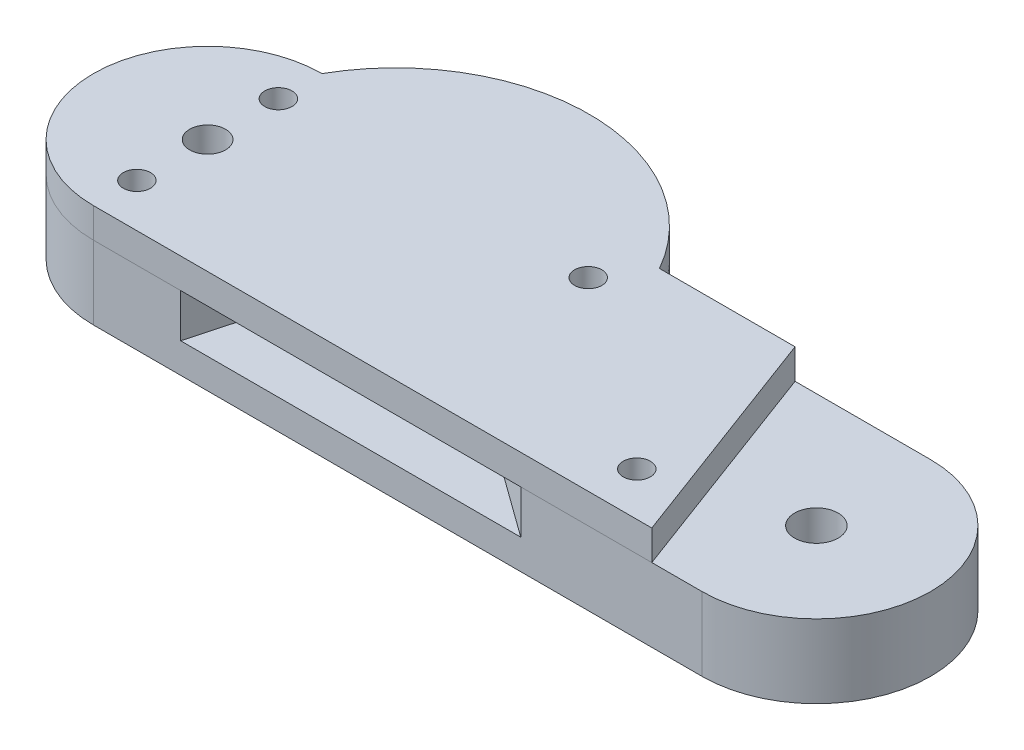
ISO-10303-21;
HEADER;
FILE_DESCRIPTION(('STEP AP214'),'2;1');
FILE_NAME('part.step','',(''),(''),'','','');
FILE_SCHEMA(('AUTOMOTIVE_DESIGN { 1 0 10303 214 1 1 1 1 }'));
ENDSEC;
DATA;
#1=APPLICATION_CONTEXT('core data for automotive mechanical design processes');
#2=APPLICATION_PROTOCOL_DEFINITION('international standard','automotive_design',2000,#1);
#3=PRODUCT_CONTEXT('',#1,'mechanical');
#4=PRODUCT('Part','Part','',(#3));
#5=PRODUCT_RELATED_PRODUCT_CATEGORY('part','',(#4));
#6=PRODUCT_DEFINITION_FORMATION('','',#4);
#7=PRODUCT_DEFINITION_CONTEXT('part definition',#1,'design');
#8=PRODUCT_DEFINITION('design','',#6,#7);
#9=PRODUCT_DEFINITION_SHAPE('','',#8);
#10=(LENGTH_UNIT() NAMED_UNIT(*) SI_UNIT(.MILLI.,.METRE.));
#11=(NAMED_UNIT(*) PLANE_ANGLE_UNIT() SI_UNIT($,.RADIAN.));
#12=(NAMED_UNIT(*) SI_UNIT($,.STERADIAN.) SOLID_ANGLE_UNIT());
#13=UNCERTAINTY_MEASURE_WITH_UNIT(LENGTH_MEASURE(1.E-05),#10,'distance_accuracy_value','');
#14=(GEOMETRIC_REPRESENTATION_CONTEXT(3) GLOBAL_UNCERTAINTY_ASSIGNED_CONTEXT((#13)) GLOBAL_UNIT_ASSIGNED_CONTEXT((#10,
#11,#12)) REPRESENTATION_CONTEXT('',''));
#15=CARTESIAN_POINT('',(0.,0.,0.));
#16=DIRECTION('',(0.,0.,1.));
#17=DIRECTION('',(1.,0.,0.));
#18=AXIS2_PLACEMENT_3D('',#15,#16,#17);
#19=CARTESIAN_POINT('',(0.,2.,0.));
#20=DIRECTION('',(0.,-1.,0.));
#21=DIRECTION('',(0.,0.,-1.));
#22=AXIS2_PLACEMENT_3D('',#19,#20,#21);
#23=PLANE('',#22);
#24=CARTESIAN_POINT('',(-40.4241193156667,2.,-1.7460511013579));
#25=DIRECTION('',(0.,1.,0.));
#26=DIRECTION('',(0.,0.,1.));
#27=AXIS2_PLACEMENT_3D('',#24,#25,#26);
#28=CIRCLE('',#27,17.8069548217708);
#29=CARTESIAN_POINT('',(-24.917700351162,2.,-10.5003992165423));
#30=VERTEX_POINT('',#29);
#31=CARTESIAN_POINT('',(-55.9305382801715,2.,-10.5003992165423));
#32=VERTEX_POINT('',#31);
#33=EDGE_CURVE('E150',#30,#32,#28,.T.);
#34=ORIENTED_EDGE('',*,*,#33,.F.);
#35=DIRECTION('',(1.,0.,0.));
#36=VECTOR('',#35,1.);
#37=CARTESIAN_POINT('',(0.,2.,-10.5003992165423));
#38=LINE('',#37,#36);
#39=CARTESIAN_POINT('',(-12.458850175581,2.,-10.5003992165423));
#40=VERTEX_POINT('',#39);
#41=EDGE_CURVE('E115',#30,#40,#38,.T.);
#42=ORIENTED_EDGE('',*,*,#41,.T.);
#43=DIRECTION('',(-0.349715205744596,0.,-0.93685605877905));
#44=VECTOR('',#43,1.);
#45=CARTESIAN_POINT('',(-12.458850175581,2.,-10.5003992165423));
#46=LINE('',#45,#44);
#47=CARTESIAN_POINT('',(-4.6195471407067,2.,10.5003992165423));
#48=VERTEX_POINT('',#47);
#49=EDGE_CURVE('E100',#48,#40,#46,.T.);
#50=ORIENTED_EDGE('',*,*,#49,.F.);
#51=DIRECTION('',(1.,0.,0.));
#52=VECTOR('',#51,1.);
#53=CARTESIAN_POINT('',(0.,2.,10.5003992165423));
#54=LINE('',#53,#52);
#55=CARTESIAN_POINT('',(-55.9305382801715,2.,10.5003992165423));
#56=VERTEX_POINT('',#55);
#57=EDGE_CURVE('E94',#56,#48,#54,.T.);
#58=ORIENTED_EDGE('',*,*,#57,.F.);
#59=CARTESIAN_POINT('',(-55.9305382801715,2.,0.));
#60=DIRECTION('',(0.,-1.,0.));
#61=DIRECTION('',(0.,0.,-1.));
#62=AXIS2_PLACEMENT_3D('',#59,#60,#61);
#63=CIRCLE('',#62,10.5003992165423);
#64=EDGE_CURVE('E98',#56,#32,#63,.T.);
#65=ORIENTED_EDGE('',*,*,#64,.T.);
#66=EDGE_LOOP('',(#34,#42,#50,#58,#65));
#67=FACE_BOUND('',#66,.T.);
#68=CARTESIAN_POINT('',(-55.9305382801715,2.,6.5003992165423));
#69=DIRECTION('',(0.,-1.,0.));
#70=DIRECTION('',(0.,0.,-1.));
#71=AXIS2_PLACEMENT_3D('',#68,#69,#70);
#72=CIRCLE('',#71,1.25);
#73=CARTESIAN_POINT('',(-55.9305382801715,2.,5.25039921654231));
#74=VERTEX_POINT('',#73);
#75=EDGE_CURVE('E123',#74,#74,#72,.F.);
#76=ORIENTED_EDGE('',*,*,#75,.T.);
#77=EDGE_LOOP('',(#76));
#78=FACE_BOUND('',#77,.T.);
#79=CARTESIAN_POINT('',(-55.9305382801715,2.,0.));
#80=DIRECTION('',(0.,-1.,0.));
#81=DIRECTION('',(0.,0.,-1.));
#82=AXIS2_PLACEMENT_3D('',#79,#80,#81);
#83=CIRCLE('',#82,1.65);
#84=CARTESIAN_POINT('',(-55.9305382801715,2.,-1.65));
#85=VERTEX_POINT('',#84);
#86=EDGE_CURVE('E103',#85,#85,#83,.T.);
#87=ORIENTED_EDGE('',*,*,#86,.F.);
#88=EDGE_LOOP('',(#87));
#89=FACE_BOUND('',#88,.T.);
#90=CARTESIAN_POINT('',(-55.9305382801715,2.,-6.5003992165423));
#91=DIRECTION('',(0.,-1.,0.));
#92=DIRECTION('',(0.,0.,-1.));
#93=AXIS2_PLACEMENT_3D('',#90,#91,#92);
#94=CIRCLE('',#93,1.25);
#95=CARTESIAN_POINT('',(-55.9305382801715,2.,-7.7503992165423));
#96=VERTEX_POINT('',#95);
#97=EDGE_CURVE('E117',#96,#96,#94,.F.);
#98=ORIENTED_EDGE('',*,*,#97,.T.);
#99=EDGE_LOOP('',(#98));
#100=FACE_BOUND('',#99,.T.);
#101=CARTESIAN_POINT('',(-27.4615510728353,2.,-6.5003992165423));
#102=DIRECTION('',(0.,-1.,0.));
#103=DIRECTION('',(0.,0.,-1.));
#104=AXIS2_PLACEMENT_3D('',#101,#102,#103);
#105=CIRCLE('',#104,1.25);
#106=CARTESIAN_POINT('',(-27.4615510728353,2.,-7.7503992165423));
#107=VERTEX_POINT('',#106);
#108=EDGE_CURVE('E129',#107,#107,#105,.F.);
#109=ORIENTED_EDGE('',*,*,#108,.T.);
#110=EDGE_LOOP('',(#109));
#111=FACE_BOUND('',#110,.T.);
#112=CARTESIAN_POINT('',(-10.,2.,6.5003992165423));
#113=DIRECTION('',(0.,-1.,0.));
#114=DIRECTION('',(0.,0.,-1.));
#115=AXIS2_PLACEMENT_3D('',#112,#113,#114);
#116=CIRCLE('',#115,1.25);
#117=CARTESIAN_POINT('',(-10.,2.,5.2503992165423));
#118=VERTEX_POINT('',#117);
#119=EDGE_CURVE('E126',#118,#118,#116,.F.);
#120=ORIENTED_EDGE('',*,*,#119,.T.);
#121=EDGE_LOOP('',(#120));
#122=FACE_BOUND('',#121,.T.);
#123=ADVANCED_FACE('F49',(#67,#78,#89,#100,#111,#122),#23,.T.);
#124=CARTESIAN_POINT('',(0.,4.75,10.5003992165423));
#125=DIRECTION('',(0.,0.,-1.));
#126=DIRECTION('',(-1.,0.,0.));
#127=AXIS2_PLACEMENT_3D('',#124,#125,#126);
#128=PLANE('',#127);
#129=ORIENTED_EDGE('',*,*,#57,.T.);
#130=DIRECTION('',(0.,1.,0.));
#131=VECTOR('',#130,1.);
#132=CARTESIAN_POINT('',(-4.6195471407067,-29.1152802892206,10.5003992165423));
#133=LINE('',#132,#131);
#134=CARTESIAN_POINT('',(-4.6195471407067,4.75,10.5003992165423));
#135=VERTEX_POINT('',#134);
#136=EDGE_CURVE('E134',#48,#135,#133,.T.);
#137=ORIENTED_EDGE('',*,*,#136,.T.);
#138=DIRECTION('',(1.,0.,0.));
#139=VECTOR('',#138,1.);
#140=CARTESIAN_POINT('',(0.,4.75,10.5003992165423));
#141=LINE('',#140,#139);
#142=CARTESIAN_POINT('',(-55.9305382801715,4.75,10.5003992165423));
#143=VERTEX_POINT('',#142);
#144=EDGE_CURVE('E110',#143,#135,#141,.T.);
#145=ORIENTED_EDGE('',*,*,#144,.F.);
#146=DIRECTION('',(0.,-1.,0.));
#147=VECTOR('',#146,1.);
#148=CARTESIAN_POINT('',(-55.9305382801715,4.75,10.5003992165423));
#149=LINE('',#148,#147);
#150=EDGE_CURVE('E107',#143,#56,#149,.T.);
#151=ORIENTED_EDGE('',*,*,#150,.T.);
#152=EDGE_LOOP('',(#129,#137,#145,#151));
#153=FACE_BOUND('',#152,.T.);
#154=ADVANCED_FACE('F108',(#153),#128,.F.);
#155=CARTESIAN_POINT('',(0.,4.75,0.));
#156=DIRECTION('',(0.,1.,0.));
#157=DIRECTION('',(0.,0.,1.));
#158=AXIS2_PLACEMENT_3D('',#155,#156,#157);
#159=PLANE('',#158);
#160=DIRECTION('',(0.349715205744595,0.,0.93685605877905));
#161=VECTOR('',#160,1.);
#162=CARTESIAN_POINT('',(-12.458850175581,4.75,-10.5003992165423));
#163=LINE('',#162,#161);
#164=CARTESIAN_POINT('',(-12.458850175581,4.75,-10.5003992165423));
#165=VERTEX_POINT('',#164);
#166=EDGE_CURVE('E13',#165,#135,#163,.T.);
#167=ORIENTED_EDGE('',*,*,#166,.F.);
#168=DIRECTION('',(-1.,0.,0.));
#169=VECTOR('',#168,1.);
#170=CARTESIAN_POINT('',(0.,4.75,-10.5003992165423));
#171=LINE('',#170,#169);
#172=CARTESIAN_POINT('',(-24.917700351162,4.75,-10.5003992165423));
#173=VERTEX_POINT('',#172);
#174=EDGE_CURVE('E158',#165,#173,#171,.T.);
#175=ORIENTED_EDGE('',*,*,#174,.T.);
#176=CARTESIAN_POINT('',(-40.4241193156667,4.75,-1.7460511013579));
#177=DIRECTION('',(0.,1.,0.));
#178=DIRECTION('',(0.,0.,1.));
#179=AXIS2_PLACEMENT_3D('',#176,#177,#178);
#180=CIRCLE('',#179,17.8069548217708);
#181=CARTESIAN_POINT('',(-55.9305382801715,4.75,-10.5003992165423));
#182=VERTEX_POINT('',#181);
#183=EDGE_CURVE('E152',#173,#182,#180,.T.);
#184=ORIENTED_EDGE('',*,*,#183,.T.);
#185=CARTESIAN_POINT('',(-55.9305382801715,4.75,0.));
#186=DIRECTION('',(0.,1.,0.));
#187=DIRECTION('',(0.,0.,1.));
#188=AXIS2_PLACEMENT_3D('',#185,#186,#187);
#189=CIRCLE('',#188,10.5003992165423);
#190=EDGE_CURVE('E160',#182,#143,#189,.T.);
#191=ORIENTED_EDGE('',*,*,#190,.T.);
#192=ORIENTED_EDGE('',*,*,#144,.T.);
#193=EDGE_LOOP('',(#167,#175,#184,#191,#192));
#194=FACE_BOUND('',#193,.T.);
#195=CARTESIAN_POINT('',(-55.9305382801715,4.75,-6.5003992165423));
#196=DIRECTION('',(0.,-1.,0.));
#197=DIRECTION('',(0.,0.,-1.));
#198=AXIS2_PLACEMENT_3D('',#195,#196,#197);
#199=CIRCLE('',#198,1.25);
#200=CARTESIAN_POINT('',(-55.9305382801715,4.75,-7.7503992165423));
#201=VERTEX_POINT('',#200);
#202=EDGE_CURVE('E135',#201,#201,#199,.T.);
#203=ORIENTED_EDGE('',*,*,#202,.T.);
#204=EDGE_LOOP('',(#203));
#205=FACE_BOUND('',#204,.T.);
#206=CARTESIAN_POINT('',(-55.9305382801715,4.75,6.5003992165423));
#207=DIRECTION('',(0.,-1.,0.));
#208=DIRECTION('',(0.,0.,-1.));
#209=AXIS2_PLACEMENT_3D('',#206,#207,#208);
#210=CIRCLE('',#209,1.25);
#211=CARTESIAN_POINT('',(-55.9305382801715,4.75,5.25039921654231));
#212=VERTEX_POINT('',#211);
#213=EDGE_CURVE('E142',#212,#212,#210,.T.);
#214=ORIENTED_EDGE('',*,*,#213,.T.);
#215=EDGE_LOOP('',(#214));
#216=FACE_BOUND('',#215,.T.);
#217=CARTESIAN_POINT('',(-10.,4.75,6.5003992165423));
#218=DIRECTION('',(0.,-1.,0.));
#219=DIRECTION('',(0.,0.,-1.));
#220=AXIS2_PLACEMENT_3D('',#217,#218,#219);
#221=CIRCLE('',#220,1.25);
#222=CARTESIAN_POINT('',(-10.,4.75,5.2503992165423));
#223=VERTEX_POINT('',#222);
#224=EDGE_CURVE('E139',#223,#223,#221,.T.);
#225=ORIENTED_EDGE('',*,*,#224,.T.);
#226=EDGE_LOOP('',(#225));
#227=FACE_BOUND('',#226,.T.);
#228=CARTESIAN_POINT('',(-27.4615510728353,4.75,-6.5003992165423));
#229=DIRECTION('',(0.,-1.,0.));
#230=DIRECTION('',(0.,0.,-1.));
#231=AXIS2_PLACEMENT_3D('',#228,#229,#230);
#232=CIRCLE('',#231,1.25);
#233=CARTESIAN_POINT('',(-27.4615510728353,4.75,-7.7503992165423));
#234=VERTEX_POINT('',#233);
#235=EDGE_CURVE('E143',#234,#234,#232,.T.);
#236=ORIENTED_EDGE('',*,*,#235,.T.);
#237=EDGE_LOOP('',(#236));
#238=FACE_BOUND('',#237,.T.);
#239=CARTESIAN_POINT('',(-55.9305382801715,4.75,0.));
#240=DIRECTION('',(0.,1.,0.));
#241=DIRECTION('',(0.,0.,1.));
#242=AXIS2_PLACEMENT_3D('',#239,#240,#241);
#243=CIRCLE('',#242,1.65);
#244=CARTESIAN_POINT('',(-55.9305382801715,4.75,1.65));
#245=VERTEX_POINT('',#244);
#246=EDGE_CURVE('E155',#245,#245,#243,.T.);
#247=ORIENTED_EDGE('',*,*,#246,.F.);
#248=EDGE_LOOP('',(#247));
#249=FACE_BOUND('',#248,.T.);
#250=ADVANCED_FACE('F163',(#194,#205,#216,#227,#238,#249),#159,.T.);
#251=CARTESIAN_POINT('',(0.,4.75,-10.5003992165423));
#252=DIRECTION('',(0.,0.,1.));
#253=DIRECTION('',(1.,0.,0.));
#254=AXIS2_PLACEMENT_3D('',#251,#252,#253);
#255=PLANE('',#254);
#256=ORIENTED_EDGE('',*,*,#41,.F.);
#257=DIRECTION('',(0.,-1.,0.));
#258=VECTOR('',#257,1.);
#259=CARTESIAN_POINT('',(-24.917700351162,37.0570550282,-10.5003992165423));
#260=LINE('',#259,#258);
#261=EDGE_CURVE('E53',#173,#30,#260,.T.);
#262=ORIENTED_EDGE('',*,*,#261,.F.);
#263=ORIENTED_EDGE('',*,*,#174,.F.);
#264=DIRECTION('',(0.,1.,0.));
#265=VECTOR('',#264,1.);
#266=CARTESIAN_POINT('',(-12.458850175581,-29.1152802892206,-10.5003992165423));
#267=LINE('',#266,#265);
#268=EDGE_CURVE('E58',#40,#165,#267,.T.);
#269=ORIENTED_EDGE('',*,*,#268,.F.);
#270=EDGE_LOOP('',(#256,#262,#263,#269));
#271=FACE_BOUND('',#270,.T.);
#272=ADVANCED_FACE('F173',(#271),#255,.F.);
#273=CARTESIAN_POINT('',(-12.458850175581,-29.1152802892206,-10.5003992165423));
#274=DIRECTION('',(-0.93685605877905,0.,0.349715205744596));
#275=DIRECTION('',(0.349715205744596,0.,0.93685605877905));
#276=AXIS2_PLACEMENT_3D('',#273,#274,#275);
#277=PLANE('',#276);
#278=ORIENTED_EDGE('',*,*,#49,.T.);
#279=ORIENTED_EDGE('',*,*,#268,.T.);
#280=ORIENTED_EDGE('',*,*,#166,.T.);
#281=ORIENTED_EDGE('',*,*,#136,.F.);
#282=EDGE_LOOP('',(#278,#279,#280,#281));
#283=FACE_BOUND('',#282,.T.);
#284=ADVANCED_FACE('F175',(#283),#277,.F.);
#285=CARTESIAN_POINT('',(-55.9305382801715,4.75,0.));
#286=DIRECTION('',(0.,-1.,0.));
#287=DIRECTION('',(0.,0.,-1.));
#288=AXIS2_PLACEMENT_3D('',#285,#286,#287);
#289=CYLINDRICAL_SURFACE('',#288,10.5003992165423);
#290=ORIENTED_EDGE('',*,*,#64,.F.);
#291=ORIENTED_EDGE('',*,*,#150,.F.);
#292=ORIENTED_EDGE('',*,*,#190,.F.);
#293=DIRECTION('',(0.,-1.,0.));
#294=VECTOR('',#293,1.);
#295=CARTESIAN_POINT('',(-55.9305382801715,4.75,-10.5003992165423));
#296=LINE('',#295,#294);
#297=EDGE_CURVE('E102',#182,#32,#296,.T.);
#298=ORIENTED_EDGE('',*,*,#297,.T.);
#299=EDGE_LOOP('',(#290,#291,#292,#298));
#300=FACE_BOUND('',#299,.T.);
#301=ADVANCED_FACE('F114',(#300),#289,.T.);
#302=CARTESIAN_POINT('',(-40.4241193156667,37.0570550282,-1.7460511013579));
#303=DIRECTION('',(0.,-1.,0.));
#304=DIRECTION('',(0.,0.,-1.));
#305=AXIS2_PLACEMENT_3D('',#302,#303,#304);
#306=CYLINDRICAL_SURFACE('',#305,17.8069548217708);
#307=ORIENTED_EDGE('',*,*,#261,.T.);
#308=ORIENTED_EDGE('',*,*,#33,.T.);
#309=ORIENTED_EDGE('',*,*,#297,.F.);
#310=ORIENTED_EDGE('',*,*,#183,.F.);
#311=EDGE_LOOP('',(#307,#308,#309,#310));
#312=FACE_BOUND('',#311,.T.);
#313=ADVANCED_FACE('F170',(#312),#306,.T.);
#314=CARTESIAN_POINT('',(-55.9305382801715,4.75,0.));
#315=DIRECTION('',(0.,-1.,0.));
#316=DIRECTION('',(0.,0.,-1.));
#317=AXIS2_PLACEMENT_3D('',#314,#315,#316);
#318=CYLINDRICAL_SURFACE('',#317,1.65);
#319=ORIENTED_EDGE('',*,*,#246,.T.);
#320=EDGE_LOOP('',(#319));
#321=FACE_BOUND('',#320,.T.);
#322=ORIENTED_EDGE('',*,*,#86,.T.);
#323=EDGE_LOOP('',(#322));
#324=FACE_BOUND('',#323,.T.);
#325=ADVANCED_FACE('F191',(#321,#324),#318,.F.);
#326=CARTESIAN_POINT('',(-55.9305382801715,4.75,-6.5003992165423));
#327=DIRECTION('',(0.,-1.,0.));
#328=DIRECTION('',(0.,0.,-1.));
#329=AXIS2_PLACEMENT_3D('',#326,#327,#328);
#330=CYLINDRICAL_SURFACE('',#329,1.25);
#331=ORIENTED_EDGE('',*,*,#202,.F.);
#332=EDGE_LOOP('',(#331));
#333=FACE_BOUND('',#332,.T.);
#334=ORIENTED_EDGE('',*,*,#97,.F.);
#335=EDGE_LOOP('',(#334));
#336=FACE_BOUND('',#335,.T.);
#337=ADVANCED_FACE('F194',(#333,#336),#330,.F.);
#338=CARTESIAN_POINT('',(-55.9305382801715,4.75,6.5003992165423));
#339=DIRECTION('',(0.,-1.,0.));
#340=DIRECTION('',(0.,0.,-1.));
#341=AXIS2_PLACEMENT_3D('',#338,#339,#340);
#342=CYLINDRICAL_SURFACE('',#341,1.25);
#343=ORIENTED_EDGE('',*,*,#213,.F.);
#344=EDGE_LOOP('',(#343));
#345=FACE_BOUND('',#344,.T.);
#346=ORIENTED_EDGE('',*,*,#75,.F.);
#347=EDGE_LOOP('',(#346));
#348=FACE_BOUND('',#347,.T.);
#349=ADVANCED_FACE('F198',(#345,#348),#342,.F.);
#350=CARTESIAN_POINT('',(-10.,4.75,6.5003992165423));
#351=DIRECTION('',(0.,-1.,0.));
#352=DIRECTION('',(0.,0.,-1.));
#353=AXIS2_PLACEMENT_3D('',#350,#351,#352);
#354=CYLINDRICAL_SURFACE('',#353,1.25);
#355=ORIENTED_EDGE('',*,*,#224,.F.);
#356=EDGE_LOOP('',(#355));
#357=FACE_BOUND('',#356,.T.);
#358=ORIENTED_EDGE('',*,*,#119,.F.);
#359=EDGE_LOOP('',(#358));
#360=FACE_BOUND('',#359,.T.);
#361=ADVANCED_FACE('F201',(#357,#360),#354,.F.);
#362=CARTESIAN_POINT('',(-27.4615510728353,4.75,-6.5003992165423));
#363=DIRECTION('',(0.,-1.,0.));
#364=DIRECTION('',(0.,0.,-1.));
#365=AXIS2_PLACEMENT_3D('',#362,#363,#364);
#366=CYLINDRICAL_SURFACE('',#365,1.25);
#367=ORIENTED_EDGE('',*,*,#235,.F.);
#368=EDGE_LOOP('',(#367));
#369=FACE_BOUND('',#368,.T.);
#370=ORIENTED_EDGE('',*,*,#108,.F.);
#371=EDGE_LOOP('',(#370));
#372=FACE_BOUND('',#371,.T.);
#373=ADVANCED_FACE('F51',(#369,#372),#366,.F.);
#374=CLOSED_SHELL('',(#123,#154,#250,#272,#284,#301,#313,#325,#337,#349,#361,#373));
#375=MANIFOLD_SOLID_BREP('B2',#374);
#376=CARTESIAN_POINT('',(0.,2.,0.));
#377=DIRECTION('',(0.,-1.,0.));
#378=DIRECTION('',(0.,0.,-1.));
#379=AXIS2_PLACEMENT_3D('',#376,#377,#378);
#380=PLANE('',#379);
#381=CARTESIAN_POINT('',(-55.9305382801715,2.,-6.5003992165423));
#382=DIRECTION('',(0.,-1.,0.));
#383=DIRECTION('',(0.,0.,-1.));
#384=AXIS2_PLACEMENT_3D('',#381,#382,#383);
#385=CIRCLE('',#384,1.25);
#386=CARTESIAN_POINT('',(-55.9305382801715,2.,-7.7503992165423));
#387=VERTEX_POINT('',#386);
#388=EDGE_CURVE('E456',#387,#387,#385,.F.);
#389=ORIENTED_EDGE('',*,*,#388,.F.);
#390=EDGE_LOOP('',(#389));
#391=FACE_BOUND('',#390,.T.);
#392=CARTESIAN_POINT('',(-55.9305382801715,2.,0.));
#393=DIRECTION('',(0.,-1.,0.));
#394=DIRECTION('',(0.,0.,-1.));
#395=AXIS2_PLACEMENT_3D('',#392,#393,#394);
#396=CIRCLE('',#395,1.65);
#397=CARTESIAN_POINT('',(-55.9305382801715,2.,-1.65));
#398=VERTEX_POINT('',#397);
#399=EDGE_CURVE('E47',#398,#398,#396,.T.);
#400=ORIENTED_EDGE('',*,*,#399,.T.);
#401=EDGE_LOOP('',(#400));
#402=FACE_BOUND('',#401,.T.);
#403=CARTESIAN_POINT('',(-55.9305382801715,2.,0.));
#404=DIRECTION('',(0.,-1.,0.));
#405=DIRECTION('',(0.,0.,-1.));
#406=AXIS2_PLACEMENT_3D('',#403,#404,#405);
#407=CIRCLE('',#406,10.5003992165423);
#408=CARTESIAN_POINT('',(-55.9305382801715,2.,10.5003992165423));
#409=VERTEX_POINT('',#408);
#410=CARTESIAN_POINT('',(-55.9305382801715,2.,-10.5003992165423));
#411=VERTEX_POINT('',#410);
#412=EDGE_CURVE('E434',#409,#411,#407,.T.);
#413=ORIENTED_EDGE('',*,*,#412,.F.);
#414=DIRECTION('',(-1.,0.,0.));
#415=VECTOR('',#414,1.);
#416=CARTESIAN_POINT('',(0.,2.,10.5003992165423));
#417=LINE('',#416,#415);
#418=CARTESIAN_POINT('',(-47.9106890267398,2.,10.5003992165423));
#419=VERTEX_POINT('',#418);
#420=EDGE_CURVE('E452',#419,#409,#417,.T.);
#421=ORIENTED_EDGE('',*,*,#420,.F.);
#422=DIRECTION('',(-0.263153614525289,0.,0.964753945398657));
#423=VECTOR('',#422,1.);
#424=CARTESIAN_POINT('',(-43.8872651072943,2.,-4.24997427651618));
#425=LINE('',#424,#423);
#426=CARTESIAN_POINT('',(-43.8872651072943,2.,-4.24997427651618));
#427=VERTEX_POINT('',#426);
#428=EDGE_CURVE('E748',#427,#419,#425,.T.);
#429=ORIENTED_EDGE('',*,*,#428,.F.);
#430=DIRECTION('',(0.810372315489383,0.,0.585915275691269));
#431=VECTOR('',#430,1.);
#432=CARTESIAN_POINT('',(-43.8872651072943,2.,-4.24997427651618));
#433=LINE('',#432,#431);
#434=CARTESIAN_POINT('',(-54.8543825263999,2.,-12.1794179449777));
#435=VERTEX_POINT('',#434);
#436=EDGE_CURVE('E760',#435,#427,#433,.T.);
#437=ORIENTED_EDGE('',*,*,#436,.F.);
#438=CARTESIAN_POINT('',(-40.4241193156667,2.,-1.7460511013579));
#439=DIRECTION('',(0.,-1.,0.));
#440=DIRECTION('',(0.,0.,-1.));
#441=AXIS2_PLACEMENT_3D('',#438,#439,#440);
#442=CIRCLE('',#441,17.8069548217708);
#443=EDGE_CURVE('E338',#411,#435,#442,.T.);
#444=ORIENTED_EDGE('',*,*,#443,.F.);
#445=EDGE_LOOP('',(#413,#421,#429,#437,#444));
#446=FACE_BOUND('',#445,.T.);
#447=CARTESIAN_POINT('',(-55.9305382801715,2.,6.5003992165423));
#448=DIRECTION('',(0.,-1.,0.));
#449=DIRECTION('',(0.,0.,-1.));
#450=AXIS2_PLACEMENT_3D('',#447,#448,#449);
#451=CIRCLE('',#450,1.25);
#452=CARTESIAN_POINT('',(-55.9305382801715,2.,5.25039921654231));
#453=VERTEX_POINT('',#452);
#454=EDGE_CURVE('E460',#453,#453,#451,.F.);
#455=ORIENTED_EDGE('',*,*,#454,.F.);
#456=EDGE_LOOP('',(#455));
#457=FACE_BOUND('',#456,.T.);
#458=ADVANCED_FACE('F315',(#391,#402,#446,#457),#380,.F.);
#459=CARTESIAN_POINT('',(-41.5933955268113,2.,-5.05946240908561));
#460=DIRECTION('',(0.,1.,0.));
#461=DIRECTION('',(0.,0.,1.));
#462=AXIS2_PLACEMENT_3D('',#459,#460,#461);
#463=PLANE('',#462);
#464=CARTESIAN_POINT('',(0.,2.,0.));
#465=DIRECTION('',(0.,1.,0.));
#466=DIRECTION('',(0.,0.,1.));
#467=AXIS2_PLACEMENT_3D('',#464,#465,#466);
#468=CIRCLE('',#467,2.);
#469=CARTESIAN_POINT('',(0.,2.,2.));
#470=VERTEX_POINT('',#469);
#471=EDGE_CURVE('E414',#470,#470,#468,.T.);
#472=ORIENTED_EDGE('',*,*,#471,.F.);
#473=EDGE_LOOP('',(#472));
#474=FACE_BOUND('',#473,.T.);
#475=DIRECTION('',(1.,0.,0.));
#476=VECTOR('',#475,1.);
#477=CARTESIAN_POINT('',(-12.458850175581,2.,-10.5003992165423));
#478=LINE('',#477,#476);
#479=CARTESIAN_POINT('',(-24.917700351162,2.,-10.5003992165423));
#480=VERTEX_POINT('',#479);
#481=CARTESIAN_POINT('',(0.,2.,-10.5003992165423));
#482=VERTEX_POINT('',#481);
#483=EDGE_CURVE('E330',#480,#482,#478,.T.);
#484=ORIENTED_EDGE('',*,*,#483,.F.);
#485=CARTESIAN_POINT('',(-35.7381547906292,2.,-18.9253810211969));
#486=VERTEX_POINT('',#485);
#487=EDGE_CURVE('E454',#486,#480,#442,.T.);
#488=ORIENTED_EDGE('',*,*,#487,.F.);
#489=DIRECTION('',(0.263153614525288,0.,-0.964753945398658));
#490=VECTOR('',#489,1.);
#491=CARTESIAN_POINT('',(-35.7518279113757,2.,-18.8752536565782));
#492=LINE('',#491,#490);
#493=CARTESIAN_POINT('',(-39.2995259463282,2.,-5.86895054165502));
#494=VERTEX_POINT('',#493);
#495=EDGE_CURVE('E758',#494,#486,#492,.T.);
#496=ORIENTED_EDGE('',*,*,#495,.F.);
#497=DIRECTION('',(-0.810372315489383,0.,-0.585915275691269));
#498=VECTOR('',#497,1.);
#499=CARTESIAN_POINT('',(26.6452391554762,2.,41.8104240945407));
#500=LINE('',#499,#498);
#501=CARTESIAN_POINT('',(-16.659276720951,2.,10.5003992165423));
#502=VERTEX_POINT('',#501);
#503=EDGE_CURVE('E744',#502,#494,#500,.T.);
#504=ORIENTED_EDGE('',*,*,#503,.F.);
#505=DIRECTION('',(-1.,0.,0.));
#506=VECTOR('',#505,1.);
#507=CARTESIAN_POINT('',(-4.6195471407067,2.,10.5003992165423));
#508=LINE('',#507,#506);
#509=CARTESIAN_POINT('',(0.,2.,10.5003992165423));
#510=VERTEX_POINT('',#509);
#511=EDGE_CURVE('E402',#510,#502,#508,.T.);
#512=ORIENTED_EDGE('',*,*,#511,.F.);
#513=CARTESIAN_POINT('',(0.,2.,0.));
#514=DIRECTION('',(0.,1.,0.));
#515=DIRECTION('',(0.,0.,1.));
#516=AXIS2_PLACEMENT_3D('',#513,#514,#515);
#517=CIRCLE('',#516,10.5003992165423);
#518=EDGE_CURVE('E398',#482,#510,#517,.F.);
#519=ORIENTED_EDGE('',*,*,#518,.F.);
#520=EDGE_LOOP('',(#484,#488,#496,#504,#512,#519));
#521=FACE_BOUND('',#520,.T.);
#522=CARTESIAN_POINT('',(-10.,2.,6.5003992165423));
#523=DIRECTION('',(0.,-1.,0.));
#524=DIRECTION('',(0.,0.,-1.));
#525=AXIS2_PLACEMENT_3D('',#522,#523,#524);
#526=CIRCLE('',#525,1.25);
#527=CARTESIAN_POINT('',(-10.,2.,5.2503992165423));
#528=VERTEX_POINT('',#527);
#529=EDGE_CURVE('E462',#528,#528,#526,.F.);
#530=ORIENTED_EDGE('',*,*,#529,.F.);
#531=EDGE_LOOP('',(#530));
#532=FACE_BOUND('',#531,.T.);
#533=CARTESIAN_POINT('',(-27.4615510728353,2.,-6.5003992165423));
#534=DIRECTION('',(0.,-1.,0.));
#535=DIRECTION('',(0.,0.,-1.));
#536=AXIS2_PLACEMENT_3D('',#533,#534,#535);
#537=CIRCLE('',#536,1.25);
#538=CARTESIAN_POINT('',(-27.4615510728353,2.,-7.7503992165423));
#539=VERTEX_POINT('',#538);
#540=EDGE_CURVE('E318',#539,#539,#537,.F.);
#541=ORIENTED_EDGE('',*,*,#540,.F.);
#542=EDGE_LOOP('',(#541));
#543=FACE_BOUND('',#542,.T.);
#544=ADVANCED_FACE('F399',(#474,#521,#532,#543),#463,.T.);
#545=CARTESIAN_POINT('',(-55.9305382801715,-1.55,6.5003992165423));
#546=DIRECTION('',(0.,-1.,0.));
#547=DIRECTION('',(0.,0.,-1.));
#548=AXIS2_PLACEMENT_3D('',#545,#546,#547);
#549=CYLINDRICAL_SURFACE('',#548,2.75);
#550=CARTESIAN_POINT('',(-55.9305382801715,-1.55,6.5003992165423));
#551=DIRECTION('',(0.,-1.,0.));
#552=DIRECTION('',(0.,0.,-1.));
#553=AXIS2_PLACEMENT_3D('',#550,#551,#552);
#554=CIRCLE('',#553,2.75);
#555=CARTESIAN_POINT('',(-55.9305382801715,-1.55,3.7503992165423));
#556=VERTEX_POINT('',#555);
#557=EDGE_CURVE('E439',#556,#556,#554,.T.);
#558=ORIENTED_EDGE('',*,*,#557,.F.);
#559=EDGE_LOOP('',(#558));
#560=FACE_BOUND('',#559,.T.);
#561=CARTESIAN_POINT('',(-55.9305382801715,-4.75,6.5003992165423));
#562=DIRECTION('',(0.,-1.,0.));
#563=DIRECTION('',(0.,0.,-1.));
#564=AXIS2_PLACEMENT_3D('',#561,#562,#563);
#565=CIRCLE('',#564,2.75);
#566=CARTESIAN_POINT('',(-55.9305382801715,-4.75,3.7503992165423));
#567=VERTEX_POINT('',#566);
#568=EDGE_CURVE('E728',#567,#567,#565,.T.);
#569=ORIENTED_EDGE('',*,*,#568,.T.);
#570=EDGE_LOOP('',(#569));
#571=FACE_BOUND('',#570,.T.);
#572=ADVANCED_FACE('F473',(#560,#571),#549,.F.);
#573=CARTESIAN_POINT('',(-55.9305382801715,-1.55,-6.5003992165423));
#574=DIRECTION('',(0.,-1.,0.));
#575=DIRECTION('',(0.,0.,-1.));
#576=AXIS2_PLACEMENT_3D('',#573,#574,#575);
#577=CYLINDRICAL_SURFACE('',#576,2.75);
#578=CARTESIAN_POINT('',(-55.9305382801715,-1.55,-6.5003992165423));
#579=DIRECTION('',(0.,-1.,0.));
#580=DIRECTION('',(0.,0.,-1.));
#581=AXIS2_PLACEMENT_3D('',#578,#579,#580);
#582=CIRCLE('',#581,2.75);
#583=CARTESIAN_POINT('',(-55.9305382801715,-1.55,-9.2503992165423));
#584=VERTEX_POINT('',#583);
#585=EDGE_CURVE('E731',#584,#584,#582,.T.);
#586=ORIENTED_EDGE('',*,*,#585,.F.);
#587=EDGE_LOOP('',(#586));
#588=FACE_BOUND('',#587,.T.);
#589=CARTESIAN_POINT('',(-55.9305382801715,-4.75,-6.5003992165423));
#590=DIRECTION('',(0.,-1.,0.));
#591=DIRECTION('',(0.,0.,-1.));
#592=AXIS2_PLACEMENT_3D('',#589,#590,#591);
#593=CIRCLE('',#592,2.75);
#594=CARTESIAN_POINT('',(-55.9305382801715,-4.75,-9.2503992165423));
#595=VERTEX_POINT('',#594);
#596=EDGE_CURVE('E804',#595,#595,#593,.T.);
#597=ORIENTED_EDGE('',*,*,#596,.T.);
#598=EDGE_LOOP('',(#597));
#599=FACE_BOUND('',#598,.T.);
#600=ADVANCED_FACE('F480',(#588,#599),#577,.F.);
#601=CARTESIAN_POINT('',(-27.4615510728353,-1.55,-6.5003992165423));
#602=DIRECTION('',(0.,-1.,0.));
#603=DIRECTION('',(0.,0.,-1.));
#604=AXIS2_PLACEMENT_3D('',#601,#602,#603);
#605=CYLINDRICAL_SURFACE('',#604,2.75);
#606=CARTESIAN_POINT('',(-27.4615510728353,-1.55,-6.5003992165423));
#607=DIRECTION('',(0.,-1.,0.));
#608=DIRECTION('',(0.,0.,-1.));
#609=AXIS2_PLACEMENT_3D('',#606,#607,#608);
#610=CIRCLE('',#609,2.75);
#611=CARTESIAN_POINT('',(-27.4615510728353,-1.55,-9.2503992165423));
#612=VERTEX_POINT('',#611);
#613=EDGE_CURVE('E807',#612,#612,#610,.T.);
#614=ORIENTED_EDGE('',*,*,#613,.F.);
#615=EDGE_LOOP('',(#614));
#616=FACE_BOUND('',#615,.T.);
#617=CARTESIAN_POINT('',(-27.4615510728353,-4.75,-6.5003992165423));
#618=DIRECTION('',(0.,-1.,0.));
#619=DIRECTION('',(0.,0.,-1.));
#620=AXIS2_PLACEMENT_3D('',#617,#618,#619);
#621=CIRCLE('',#620,2.75);
#622=CARTESIAN_POINT('',(-27.4615510728353,-4.75,-9.2503992165423));
#623=VERTEX_POINT('',#622);
#624=EDGE_CURVE('E722',#623,#623,#621,.T.);
#625=ORIENTED_EDGE('',*,*,#624,.T.);
#626=EDGE_LOOP('',(#625));
#627=FACE_BOUND('',#626,.T.);
#628=ADVANCED_FACE('F620',(#616,#627),#605,.F.);
#629=CARTESIAN_POINT('',(-10.,-1.55,6.5003992165423));
#630=DIRECTION('',(0.,-1.,0.));
#631=DIRECTION('',(0.,0.,-1.));
#632=AXIS2_PLACEMENT_3D('',#629,#630,#631);
#633=CYLINDRICAL_SURFACE('',#632,2.75);
#634=CARTESIAN_POINT('',(-10.,-1.55,6.5003992165423));
#635=DIRECTION('',(0.,-1.,0.));
#636=DIRECTION('',(0.,0.,-1.));
#637=AXIS2_PLACEMENT_3D('',#634,#635,#636);
#638=CIRCLE('',#637,2.75);
#639=CARTESIAN_POINT('',(-10.,-1.55,3.7503992165423));
#640=VERTEX_POINT('',#639);
#641=EDGE_CURVE('E718',#640,#640,#638,.T.);
#642=ORIENTED_EDGE('',*,*,#641,.F.);
#643=EDGE_LOOP('',(#642));
#644=FACE_BOUND('',#643,.T.);
#645=CARTESIAN_POINT('',(-10.,-4.75,6.5003992165423));
#646=DIRECTION('',(0.,-1.,0.));
#647=DIRECTION('',(0.,0.,-1.));
#648=AXIS2_PLACEMENT_3D('',#645,#646,#647);
#649=CIRCLE('',#648,2.75);
#650=CARTESIAN_POINT('',(-10.,-4.75,3.7503992165423));
#651=VERTEX_POINT('',#650);
#652=EDGE_CURVE('E451',#651,#651,#649,.T.);
#653=ORIENTED_EDGE('',*,*,#652,.T.);
#654=EDGE_LOOP('',(#653));
#655=FACE_BOUND('',#654,.T.);
#656=ADVANCED_FACE('F522',(#644,#655),#633,.F.);
#657=CARTESIAN_POINT('',(-35.7518279113757,-2.,-18.8752536565782));
#658=DIRECTION('',(0.964753945398658,0.,0.263153614525288));
#659=DIRECTION('',(0.263153614525288,0.,-0.964753945398658));
#660=AXIS2_PLACEMENT_3D('',#657,#658,#659);
#661=PLANE('',#660);
#662=DIRECTION('',(0.263153614525288,0.,-0.964753945398658));
#663=VECTOR('',#662,1.);
#664=CARTESIAN_POINT('',(-35.7518279113757,-2.,-18.8752536565782));
#665=LINE('',#664,#663);
#666=CARTESIAN_POINT('',(-39.2995259463282,-2.,-5.86895054165502));
#667=VERTEX_POINT('',#666);
#668=CARTESIAN_POINT('',(-35.7381547906292,-2.,-18.9253810211969));
#669=VERTEX_POINT('',#668);
#670=EDGE_CURVE('E747',#667,#669,#665,.T.);
#671=ORIENTED_EDGE('',*,*,#670,.F.);
#672=DIRECTION('',(0.,1.,0.));
#673=VECTOR('',#672,1.);
#674=CARTESIAN_POINT('',(-39.2995259463282,-2.,-5.86895054165502));
#675=LINE('',#674,#673);
#676=EDGE_CURVE('E755',#667,#494,#675,.T.);
#677=ORIENTED_EDGE('',*,*,#676,.T.);
#678=ORIENTED_EDGE('',*,*,#495,.T.);
#679=DIRECTION('',(0.,1.,0.));
#680=VECTOR('',#679,1.);
#681=CARTESIAN_POINT('',(-35.7381547906292,-2.,-18.9253810211969));
#682=LINE('',#681,#680);
#683=EDGE_CURVE('E734',#669,#486,#682,.T.);
#684=ORIENTED_EDGE('',*,*,#683,.F.);
#685=EDGE_LOOP('',(#671,#677,#678,#684));
#686=FACE_BOUND('',#685,.T.);
#687=ADVANCED_FACE('F503',(#686),#661,.F.);
#688=CARTESIAN_POINT('',(-40.4241193156667,37.0570550282,-1.7460511013579));
#689=DIRECTION('',(0.,-1.,0.));
#690=DIRECTION('',(0.,0.,-1.));
#691=AXIS2_PLACEMENT_3D('',#688,#689,#690);
#692=CYLINDRICAL_SURFACE('',#691,17.8069548217708);
#693=ORIENTED_EDGE('',*,*,#683,.T.);
#694=ORIENTED_EDGE('',*,*,#487,.T.);
#695=DIRECTION('',(0.,-1.,0.));
#696=VECTOR('',#695,1.);
#697=CARTESIAN_POINT('',(-24.917700351162,37.0570550282,-10.5003992165423));
#698=LINE('',#697,#696);
#699=CARTESIAN_POINT('',(-24.917700351162,-4.75,-10.5003992165423));
#700=VERTEX_POINT('',#699);
#701=EDGE_CURVE('E413',#480,#700,#698,.T.);
#702=ORIENTED_EDGE('',*,*,#701,.T.);
#703=CARTESIAN_POINT('',(-40.4241193156667,-4.75,-1.7460511013579));
#704=DIRECTION('',(0.,1.,0.));
#705=DIRECTION('',(0.,0.,1.));
#706=AXIS2_PLACEMENT_3D('',#703,#704,#705);
#707=CIRCLE('',#706,17.8069548217708);
#708=CARTESIAN_POINT('',(-55.9305382801715,-4.75,-10.5003992165423));
#709=VERTEX_POINT('',#708);
#710=EDGE_CURVE('E738',#709,#700,#707,.F.);
#711=ORIENTED_EDGE('',*,*,#710,.F.);
#712=DIRECTION('',(0.,-1.,0.));
#713=VECTOR('',#712,1.);
#714=CARTESIAN_POINT('',(-55.9305382801715,4.75,-10.5003992165423));
#715=LINE('',#714,#713);
#716=EDGE_CURVE('E421',#411,#709,#715,.T.);
#717=ORIENTED_EDGE('',*,*,#716,.F.);
#718=ORIENTED_EDGE('',*,*,#443,.T.);
#719=DIRECTION('',(0.,1.,0.));
#720=VECTOR('',#719,1.);
#721=CARTESIAN_POINT('',(-54.8543825263999,-2.,-12.1794179449777));
#722=LINE('',#721,#720);
#723=CARTESIAN_POINT('',(-54.8543825263999,-2.,-12.1794179449777));
#724=VERTEX_POINT('',#723);
#725=EDGE_CURVE('E735',#724,#435,#722,.T.);
#726=ORIENTED_EDGE('',*,*,#725,.F.);
#727=CARTESIAN_POINT('',(-40.4241193156667,-2.,-1.7460511013579));
#728=DIRECTION('',(0.,1.,0.));
#729=DIRECTION('',(0.,0.,1.));
#730=AXIS2_PLACEMENT_3D('',#727,#728,#729);
#731=CIRCLE('',#730,17.8069548217708);
#732=EDGE_CURVE('E448',#669,#724,#731,.T.);
#733=ORIENTED_EDGE('',*,*,#732,.F.);
#734=EDGE_LOOP('',(#693,#694,#702,#711,#717,#718,#726,#733));
#735=FACE_BOUND('',#734,.T.);
#736=ADVANCED_FACE('F499',(#735),#692,.T.);
#737=CARTESIAN_POINT('',(-55.9305382801715,4.75,0.));
#738=DIRECTION('',(0.,-1.,0.));
#739=DIRECTION('',(0.,0.,-1.));
#740=AXIS2_PLACEMENT_3D('',#737,#738,#739);
#741=CYLINDRICAL_SURFACE('',#740,10.5003992165423);
#742=DIRECTION('',(0.,-1.,0.));
#743=VECTOR('',#742,1.);
#744=CARTESIAN_POINT('',(-55.9305382801715,4.75,10.5003992165423));
#745=LINE('',#744,#743);
#746=CARTESIAN_POINT('',(-55.9305382801715,-4.75,10.5003992165423));
#747=VERTEX_POINT('',#746);
#748=EDGE_CURVE('E426',#409,#747,#745,.T.);
#749=ORIENTED_EDGE('',*,*,#748,.F.);
#750=ORIENTED_EDGE('',*,*,#412,.T.);
#751=ORIENTED_EDGE('',*,*,#716,.T.);
#752=CARTESIAN_POINT('',(-55.9305382801715,-4.75,0.));
#753=DIRECTION('',(0.,1.,0.));
#754=DIRECTION('',(0.,0.,1.));
#755=AXIS2_PLACEMENT_3D('',#752,#753,#754);
#756=CIRCLE('',#755,10.5003992165423);
#757=EDGE_CURVE('E777',#709,#747,#756,.T.);
#758=ORIENTED_EDGE('',*,*,#757,.T.);
#759=EDGE_LOOP('',(#749,#750,#751,#758));
#760=FACE_BOUND('',#759,.T.);
#761=ADVANCED_FACE('F502',(#760),#741,.T.);
#762=CARTESIAN_POINT('',(-43.8872651072943,-2.,-4.24997427651618));
#763=DIRECTION('',(-0.964753945398657,0.,-0.263153614525289));
#764=DIRECTION('',(-0.263153614525289,0.,0.964753945398657));
#765=AXIS2_PLACEMENT_3D('',#762,#763,#764);
#766=PLANE('',#765);
#767=DIRECTION('',(-0.263153614525289,0.,0.964753945398657));
#768=VECTOR('',#767,1.);
#769=CARTESIAN_POINT('',(-43.8872651072943,-2.,-4.24997427651618));
#770=LINE('',#769,#768);
#771=CARTESIAN_POINT('',(-43.8872651072943,-2.,-4.24997427651618));
#772=VERTEX_POINT('',#771);
#773=CARTESIAN_POINT('',(-47.9106890267398,-2.,10.5003992165423));
#774=VERTEX_POINT('',#773);
#775=EDGE_CURVE('E752',#772,#774,#770,.T.);
#776=ORIENTED_EDGE('',*,*,#775,.F.);
#777=DIRECTION('',(0.,1.,0.));
#778=VECTOR('',#777,1.);
#779=CARTESIAN_POINT('',(-43.8872651072943,-2.,-4.24997427651618));
#780=LINE('',#779,#778);
#781=EDGE_CURVE('E763',#772,#427,#780,.T.);
#782=ORIENTED_EDGE('',*,*,#781,.T.);
#783=ORIENTED_EDGE('',*,*,#428,.T.);
#784=DIRECTION('',(0.,1.,0.));
#785=VECTOR('',#784,1.);
#786=CARTESIAN_POINT('',(-47.9106890267398,4.75,10.5003992165423));
#787=LINE('',#786,#785);
#788=EDGE_CURVE('E420',#774,#419,#787,.T.);
#789=ORIENTED_EDGE('',*,*,#788,.F.);
#790=EDGE_LOOP('',(#776,#782,#783,#789));
#791=FACE_BOUND('',#790,.T.);
#792=ADVANCED_FACE('F509',(#791),#766,.F.);
#793=CARTESIAN_POINT('',(-41.5933955268113,-2.,-5.05946240908561));
#794=DIRECTION('',(0.,1.,0.));
#795=DIRECTION('',(0.,0.,1.));
#796=AXIS2_PLACEMENT_3D('',#793,#794,#795);
#797=PLANE('',#796);
#798=ORIENTED_EDGE('',*,*,#670,.T.);
#799=ORIENTED_EDGE('',*,*,#732,.T.);
#800=DIRECTION('',(0.810372315489383,0.,0.585915275691269));
#801=VECTOR('',#800,1.);
#802=CARTESIAN_POINT('',(-43.8872651072943,-2.,-4.24997427651618));
#803=LINE('',#802,#801);
#804=EDGE_CURVE('E750',#724,#772,#803,.T.);
#805=ORIENTED_EDGE('',*,*,#804,.T.);
#806=ORIENTED_EDGE('',*,*,#775,.T.);
#807=DIRECTION('',(1.,0.,0.));
#808=VECTOR('',#807,1.);
#809=CARTESIAN_POINT('',(0.,-2.,10.5003992165423));
#810=LINE('',#809,#808);
#811=CARTESIAN_POINT('',(-16.659276720951,-2.,10.5003992165423));
#812=VERTEX_POINT('',#811);
#813=EDGE_CURVE('E432',#774,#812,#810,.T.);
#814=ORIENTED_EDGE('',*,*,#813,.T.);
#815=DIRECTION('',(-0.810372315489383,0.,-0.585915275691269));
#816=VECTOR('',#815,1.);
#817=CARTESIAN_POINT('',(26.6452391554762,-2.,41.8104240945407));
#818=LINE('',#817,#816);
#819=EDGE_CURVE('E745',#812,#667,#818,.T.);
#820=ORIENTED_EDGE('',*,*,#819,.T.);
#821=EDGE_LOOP('',(#798,#799,#805,#806,#814,#820));
#822=FACE_BOUND('',#821,.T.);
#823=ADVANCED_FACE('F505',(#822),#797,.T.);
#824=CARTESIAN_POINT('',(26.6452391554762,-2.,41.8104240945407));
#825=DIRECTION('',(0.585915275691269,0.,-0.810372315489383));
#826=DIRECTION('',(-0.810372315489383,0.,-0.585915275691269));
#827=AXIS2_PLACEMENT_3D('',#824,#825,#826);
#828=PLANE('',#827);
#829=ORIENTED_EDGE('',*,*,#503,.T.);
#830=ORIENTED_EDGE('',*,*,#676,.F.);
#831=ORIENTED_EDGE('',*,*,#819,.F.);
#832=DIRECTION('',(0.,-1.,0.));
#833=VECTOR('',#832,1.);
#834=CARTESIAN_POINT('',(-16.659276720951,4.75,10.5003992165423));
#835=LINE('',#834,#833);
#836=EDGE_CURVE('E424',#502,#812,#835,.T.);
#837=ORIENTED_EDGE('',*,*,#836,.F.);
#838=EDGE_LOOP('',(#829,#830,#831,#837));
#839=FACE_BOUND('',#838,.T.);
#840=ADVANCED_FACE('F508',(#839),#828,.F.);
#841=CARTESIAN_POINT('',(0.,4.75,-10.5003992165423));
#842=DIRECTION('',(0.,0.,1.));
#843=DIRECTION('',(1.,0.,0.));
#844=AXIS2_PLACEMENT_3D('',#841,#842,#843);
#845=PLANE('',#844);
#846=ORIENTED_EDGE('',*,*,#701,.F.);
#847=ORIENTED_EDGE('',*,*,#483,.T.);
#848=DIRECTION('',(0.,-1.,0.));
#849=VECTOR('',#848,1.);
#850=CARTESIAN_POINT('',(0.,4.75,-10.5003992165423));
#851=LINE('',#850,#849);
#852=CARTESIAN_POINT('',(0.,-4.75,-10.5003992165423));
#853=VERTEX_POINT('',#852);
#854=EDGE_CURVE('E411',#482,#853,#851,.T.);
#855=ORIENTED_EDGE('',*,*,#854,.T.);
#856=DIRECTION('',(-1.,0.,0.));
#857=VECTOR('',#856,1.);
#858=CARTESIAN_POINT('',(0.,-4.75,-10.5003992165423));
#859=LINE('',#858,#857);
#860=EDGE_CURVE('E775',#853,#700,#859,.T.);
#861=ORIENTED_EDGE('',*,*,#860,.T.);
#862=EDGE_LOOP('',(#846,#847,#855,#861));
#863=FACE_BOUND('',#862,.T.);
#864=ADVANCED_FACE('F409',(#863),#845,.F.);
#865=CARTESIAN_POINT('',(0.,-4.75,0.));
#866=DIRECTION('',(0.,1.,0.));
#867=DIRECTION('',(0.,0.,1.));
#868=AXIS2_PLACEMENT_3D('',#865,#866,#867);
#869=PLANE('',#868);
#870=ORIENTED_EDGE('',*,*,#652,.F.);
#871=EDGE_LOOP('',(#870));
#872=FACE_BOUND('',#871,.T.);
#873=ORIENTED_EDGE('',*,*,#624,.F.);
#874=EDGE_LOOP('',(#873));
#875=FACE_BOUND('',#874,.T.);
#876=ORIENTED_EDGE('',*,*,#596,.F.);
#877=EDGE_LOOP('',(#876));
#878=FACE_BOUND('',#877,.T.);
#879=ORIENTED_EDGE('',*,*,#568,.F.);
#880=EDGE_LOOP('',(#879));
#881=FACE_BOUND('',#880,.T.);
#882=CARTESIAN_POINT('',(0.,-4.75,0.));
#883=DIRECTION('',(0.,1.,0.));
#884=DIRECTION('',(0.,0.,1.));
#885=AXIS2_PLACEMENT_3D('',#882,#883,#884);
#886=CIRCLE('',#885,10.5003992165423);
#887=CARTESIAN_POINT('',(0.,-4.75,10.5003992165423));
#888=VERTEX_POINT('',#887);
#889=EDGE_CURVE('E419',#888,#853,#886,.T.);
#890=ORIENTED_EDGE('',*,*,#889,.F.);
#891=DIRECTION('',(1.,0.,0.));
#892=VECTOR('',#891,1.);
#893=CARTESIAN_POINT('',(0.,-4.75,10.5003992165423));
#894=LINE('',#893,#892);
#895=EDGE_CURVE('E780',#747,#888,#894,.T.);
#896=ORIENTED_EDGE('',*,*,#895,.F.);
#897=ORIENTED_EDGE('',*,*,#757,.F.);
#898=ORIENTED_EDGE('',*,*,#710,.T.);
#899=ORIENTED_EDGE('',*,*,#860,.F.);
#900=EDGE_LOOP('',(#890,#896,#897,#898,#899));
#901=FACE_BOUND('',#900,.T.);
#902=CARTESIAN_POINT('',(0.,-4.75,0.));
#903=DIRECTION('',(0.,1.,0.));
#904=DIRECTION('',(0.,0.,1.));
#905=AXIS2_PLACEMENT_3D('',#902,#903,#904);
#906=CIRCLE('',#905,2.);
#907=CARTESIAN_POINT('',(0.,-4.75,2.));
#908=VERTEX_POINT('',#907);
#909=EDGE_CURVE('E771',#908,#908,#906,.T.);
#910=ORIENTED_EDGE('',*,*,#909,.T.);
#911=EDGE_LOOP('',(#910));
#912=FACE_BOUND('',#911,.T.);
#913=CARTESIAN_POINT('',(-55.9305382801715,-4.75,0.));
#914=DIRECTION('',(0.,1.,0.));
#915=DIRECTION('',(0.,0.,1.));
#916=AXIS2_PLACEMENT_3D('',#913,#914,#915);
#917=CIRCLE('',#916,1.65);
#918=CARTESIAN_POINT('',(-55.9305382801715,-4.75,1.65));
#919=VERTEX_POINT('',#918);
#920=EDGE_CURVE('E766',#919,#919,#917,.T.);
#921=ORIENTED_EDGE('',*,*,#920,.T.);
#922=EDGE_LOOP('',(#921));
#923=FACE_BOUND('',#922,.T.);
#924=ADVANCED_FACE('F534',(#872,#875,#878,#881,#901,#912,#923),#869,.F.);
#925=CARTESIAN_POINT('',(0.,4.75,10.5003992165423));
#926=DIRECTION('',(0.,0.,-1.));
#927=DIRECTION('',(-1.,0.,0.));
#928=AXIS2_PLACEMENT_3D('',#925,#926,#927);
#929=PLANE('',#928);
#930=ORIENTED_EDGE('',*,*,#511,.T.);
#931=ORIENTED_EDGE('',*,*,#836,.T.);
#932=ORIENTED_EDGE('',*,*,#813,.F.);
#933=ORIENTED_EDGE('',*,*,#788,.T.);
#934=ORIENTED_EDGE('',*,*,#420,.T.);
#935=ORIENTED_EDGE('',*,*,#748,.T.);
#936=ORIENTED_EDGE('',*,*,#895,.T.);
#937=DIRECTION('',(0.,-1.,0.));
#938=VECTOR('',#937,1.);
#939=CARTESIAN_POINT('',(0.,4.75,10.5003992165423));
#940=LINE('',#939,#938);
#941=EDGE_CURVE('E783',#510,#888,#940,.T.);
#942=ORIENTED_EDGE('',*,*,#941,.F.);
#943=EDGE_LOOP('',(#930,#931,#932,#933,#934,#935,#936,#942));
#944=FACE_BOUND('',#943,.T.);
#945=ADVANCED_FACE('F537',(#944),#929,.F.);
#946=CARTESIAN_POINT('',(0.,4.75,0.));
#947=DIRECTION('',(0.,-1.,0.));
#948=DIRECTION('',(0.,0.,-1.));
#949=AXIS2_PLACEMENT_3D('',#946,#947,#948);
#950=CYLINDRICAL_SURFACE('',#949,10.5003992165423);
#951=ORIENTED_EDGE('',*,*,#518,.T.);
#952=ORIENTED_EDGE('',*,*,#941,.T.);
#953=ORIENTED_EDGE('',*,*,#889,.T.);
#954=ORIENTED_EDGE('',*,*,#854,.F.);
#955=EDGE_LOOP('',(#951,#952,#953,#954));
#956=FACE_BOUND('',#955,.T.);
#957=ADVANCED_FACE('F417',(#956),#950,.T.);
#958=CARTESIAN_POINT('',(0.,4.75,0.));
#959=DIRECTION('',(0.,-1.,0.));
#960=DIRECTION('',(0.,0.,-1.));
#961=AXIS2_PLACEMENT_3D('',#958,#959,#960);
#962=CYLINDRICAL_SURFACE('',#961,2.);
#963=ORIENTED_EDGE('',*,*,#909,.F.);
#964=EDGE_LOOP('',(#963));
#965=FACE_BOUND('',#964,.T.);
#966=ORIENTED_EDGE('',*,*,#471,.T.);
#967=EDGE_LOOP('',(#966));
#968=FACE_BOUND('',#967,.T.);
#969=ADVANCED_FACE('F518',(#965,#968),#962,.F.);
#970=CARTESIAN_POINT('',(-43.8872651072943,-2.,-4.24997427651618));
#971=DIRECTION('',(-0.585915275691269,0.,0.810372315489383));
#972=DIRECTION('',(0.810372315489383,0.,0.585915275691269));
#973=AXIS2_PLACEMENT_3D('',#970,#971,#972);
#974=PLANE('',#973);
#975=ORIENTED_EDGE('',*,*,#436,.T.);
#976=ORIENTED_EDGE('',*,*,#781,.F.);
#977=ORIENTED_EDGE('',*,*,#804,.F.);
#978=ORIENTED_EDGE('',*,*,#725,.T.);
#979=EDGE_LOOP('',(#975,#976,#977,#978));
#980=FACE_BOUND('',#979,.T.);
#981=ADVANCED_FACE('F514',(#980),#974,.F.);
#982=CARTESIAN_POINT('',(-55.9305382801715,4.75,0.));
#983=DIRECTION('',(0.,-1.,0.));
#984=DIRECTION('',(0.,0.,-1.));
#985=AXIS2_PLACEMENT_3D('',#982,#983,#984);
#986=CYLINDRICAL_SURFACE('',#985,1.65);
#987=ORIENTED_EDGE('',*,*,#399,.F.);
#988=EDGE_LOOP('',(#987));
#989=FACE_BOUND('',#988,.T.);
#990=ORIENTED_EDGE('',*,*,#920,.F.);
#991=EDGE_LOOP('',(#990));
#992=FACE_BOUND('',#991,.T.);
#993=ADVANCED_FACE('F517',(#989,#992),#986,.F.);
#994=CARTESIAN_POINT('',(-55.9305382801715,-1.55,-6.5003992165423));
#995=DIRECTION('',(0.,-1.,0.));
#996=DIRECTION('',(0.,0.,-1.));
#997=AXIS2_PLACEMENT_3D('',#994,#995,#996);
#998=PLANE('',#997);
#999=ORIENTED_EDGE('',*,*,#585,.T.);
#1000=EDGE_LOOP('',(#999));
#1001=FACE_BOUND('',#1000,.T.);
#1002=CARTESIAN_POINT('',(-55.9305382801715,-1.55,-6.5003992165423));
#1003=DIRECTION('',(0.,-1.,0.));
#1004=DIRECTION('',(0.,0.,-1.));
#1005=AXIS2_PLACEMENT_3D('',#1002,#1003,#1004);
#1006=CIRCLE('',#1005,1.25);
#1007=CARTESIAN_POINT('',(-55.9305382801715,-1.55,-7.7503992165423));
#1008=VERTEX_POINT('',#1007);
#1009=EDGE_CURVE('E435',#1008,#1008,#1006,.F.);
#1010=ORIENTED_EDGE('',*,*,#1009,.T.);
#1011=EDGE_LOOP('',(#1010));
#1012=FACE_BOUND('',#1011,.T.);
#1013=ADVANCED_FACE('F529',(#1001,#1012),#998,.T.);
#1014=CARTESIAN_POINT('',(-55.9305382801715,4.75,-6.5003992165423));
#1015=DIRECTION('',(0.,-1.,0.));
#1016=DIRECTION('',(0.,0.,-1.));
#1017=AXIS2_PLACEMENT_3D('',#1014,#1015,#1016);
#1018=CYLINDRICAL_SURFACE('',#1017,1.25);
#1019=ORIENTED_EDGE('',*,*,#388,.T.);
#1020=EDGE_LOOP('',(#1019));
#1021=FACE_BOUND('',#1020,.T.);
#1022=ORIENTED_EDGE('',*,*,#1009,.F.);
#1023=EDGE_LOOP('',(#1022));
#1024=FACE_BOUND('',#1023,.T.);
#1025=ADVANCED_FACE('F497',(#1021,#1024),#1018,.F.);
#1026=CARTESIAN_POINT('',(-55.9305382801715,-1.55,6.5003992165423));
#1027=DIRECTION('',(0.,-1.,0.));
#1028=DIRECTION('',(0.,0.,-1.));
#1029=AXIS2_PLACEMENT_3D('',#1026,#1027,#1028);
#1030=PLANE('',#1029);
#1031=ORIENTED_EDGE('',*,*,#557,.T.);
#1032=EDGE_LOOP('',(#1031));
#1033=FACE_BOUND('',#1032,.T.);
#1034=CARTESIAN_POINT('',(-55.9305382801715,-1.55,6.5003992165423));
#1035=DIRECTION('',(0.,-1.,0.));
#1036=DIRECTION('',(0.,0.,-1.));
#1037=AXIS2_PLACEMENT_3D('',#1034,#1035,#1036);
#1038=CIRCLE('',#1037,1.25);
#1039=CARTESIAN_POINT('',(-55.9305382801715,-1.55,5.25039921654231));
#1040=VERTEX_POINT('',#1039);
#1041=EDGE_CURVE('E438',#1040,#1040,#1038,.F.);
#1042=ORIENTED_EDGE('',*,*,#1041,.T.);
#1043=EDGE_LOOP('',(#1042));
#1044=FACE_BOUND('',#1043,.T.);
#1045=ADVANCED_FACE('F578',(#1033,#1044),#1030,.T.);
#1046=CARTESIAN_POINT('',(-55.9305382801715,4.75,6.5003992165423));
#1047=DIRECTION('',(0.,-1.,0.));
#1048=DIRECTION('',(0.,0.,-1.));
#1049=AXIS2_PLACEMENT_3D('',#1046,#1047,#1048);
#1050=CYLINDRICAL_SURFACE('',#1049,1.25);
#1051=ORIENTED_EDGE('',*,*,#454,.T.);
#1052=EDGE_LOOP('',(#1051));
#1053=FACE_BOUND('',#1052,.T.);
#1054=ORIENTED_EDGE('',*,*,#1041,.F.);
#1055=EDGE_LOOP('',(#1054));
#1056=FACE_BOUND('',#1055,.T.);
#1057=ADVANCED_FACE('F586',(#1053,#1056),#1050,.F.);
#1058=CARTESIAN_POINT('',(-10.,-1.55,6.5003992165423));
#1059=DIRECTION('',(0.,-1.,0.));
#1060=DIRECTION('',(0.,0.,-1.));
#1061=AXIS2_PLACEMENT_3D('',#1058,#1059,#1060);
#1062=PLANE('',#1061);
#1063=ORIENTED_EDGE('',*,*,#641,.T.);
#1064=EDGE_LOOP('',(#1063));
#1065=FACE_BOUND('',#1064,.T.);
#1066=CARTESIAN_POINT('',(-10.,-1.55,6.5003992165423));
#1067=DIRECTION('',(0.,-1.,0.));
#1068=DIRECTION('',(0.,0.,-1.));
#1069=AXIS2_PLACEMENT_3D('',#1066,#1067,#1068);
#1070=CIRCLE('',#1069,1.25);
#1071=CARTESIAN_POINT('',(-10.,-1.55,5.2503992165423));
#1072=VERTEX_POINT('',#1071);
#1073=EDGE_CURVE('E442',#1072,#1072,#1070,.F.);
#1074=ORIENTED_EDGE('',*,*,#1073,.T.);
#1075=EDGE_LOOP('',(#1074));
#1076=FACE_BOUND('',#1075,.T.);
#1077=ADVANCED_FACE('F596',(#1065,#1076),#1062,.T.);
#1078=CARTESIAN_POINT('',(-10.,4.75,6.5003992165423));
#1079=DIRECTION('',(0.,-1.,0.));
#1080=DIRECTION('',(0.,0.,-1.));
#1081=AXIS2_PLACEMENT_3D('',#1078,#1079,#1080);
#1082=CYLINDRICAL_SURFACE('',#1081,1.25);
#1083=ORIENTED_EDGE('',*,*,#529,.T.);
#1084=EDGE_LOOP('',(#1083));
#1085=FACE_BOUND('',#1084,.T.);
#1086=ORIENTED_EDGE('',*,*,#1073,.F.);
#1087=EDGE_LOOP('',(#1086));
#1088=FACE_BOUND('',#1087,.T.);
#1089=ADVANCED_FACE('F492',(#1085,#1088),#1082,.F.);
#1090=CARTESIAN_POINT('',(-27.4615510728353,-1.55,-6.5003992165423));
#1091=DIRECTION('',(0.,-1.,0.));
#1092=DIRECTION('',(0.,0.,-1.));
#1093=AXIS2_PLACEMENT_3D('',#1090,#1091,#1092);
#1094=PLANE('',#1093);
#1095=ORIENTED_EDGE('',*,*,#613,.T.);
#1096=EDGE_LOOP('',(#1095));
#1097=FACE_BOUND('',#1096,.T.);
#1098=CARTESIAN_POINT('',(-27.4615510728353,-1.55,-6.5003992165423));
#1099=DIRECTION('',(0.,-1.,0.));
#1100=DIRECTION('',(0.,0.,-1.));
#1101=AXIS2_PLACEMENT_3D('',#1098,#1099,#1100);
#1102=CIRCLE('',#1101,1.25);
#1103=CARTESIAN_POINT('',(-27.4615510728353,-1.55,-7.7503992165423));
#1104=VERTEX_POINT('',#1103);
#1105=EDGE_CURVE('E445',#1104,#1104,#1102,.F.);
#1106=ORIENTED_EDGE('',*,*,#1105,.T.);
#1107=EDGE_LOOP('',(#1106));
#1108=FACE_BOUND('',#1107,.T.);
#1109=ADVANCED_FACE('F487',(#1097,#1108),#1094,.T.);
#1110=CARTESIAN_POINT('',(-27.4615510728353,4.75,-6.5003992165423));
#1111=DIRECTION('',(0.,-1.,0.));
#1112=DIRECTION('',(0.,0.,-1.));
#1113=AXIS2_PLACEMENT_3D('',#1110,#1111,#1112);
#1114=CYLINDRICAL_SURFACE('',#1113,1.25);
#1115=ORIENTED_EDGE('',*,*,#540,.T.);
#1116=EDGE_LOOP('',(#1115));
#1117=FACE_BOUND('',#1116,.T.);
#1118=ORIENTED_EDGE('',*,*,#1105,.F.);
#1119=EDGE_LOOP('',(#1118));
#1120=FACE_BOUND('',#1119,.T.);
#1121=ADVANCED_FACE('F469',(#1117,#1120),#1114,.F.);
#1122=CLOSED_SHELL('',(#458,#544,#572,#600,#628,#656,#687,#736,#761,#792,#823,#840,#864,#924,
#945,#957,#969,#981,#993,#1013,#1025,#1045,#1057,#1077,#1089,#1109,#1121));
#1123=MANIFOLD_SOLID_BREP('B7',#1122);
#1124=ADVANCED_BREP_SHAPE_REPRESENTATION('',(#18,#375,#1123),#14);
#1125=SHAPE_DEFINITION_REPRESENTATION(#9,#1124);
ENDSEC;
END-ISO-10303-21;
